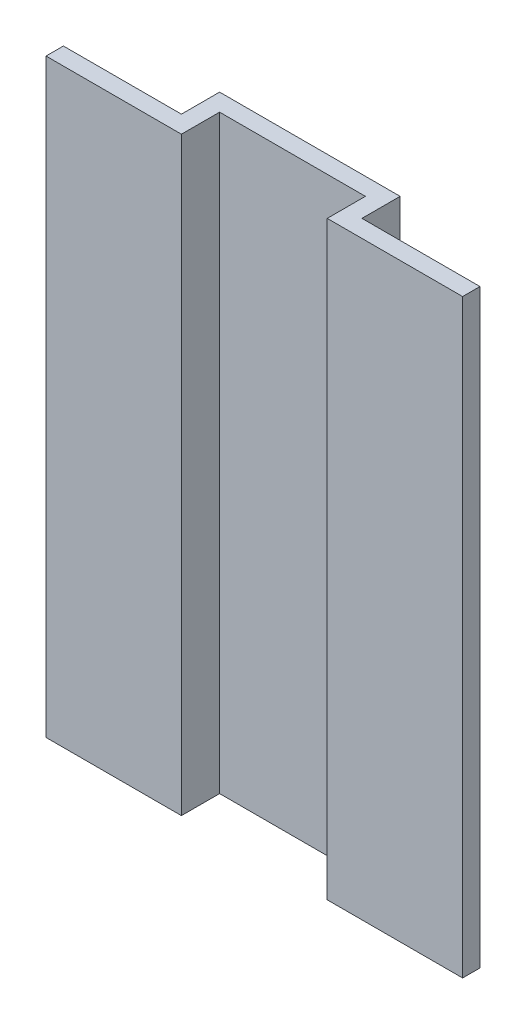
ISO-10303-21;
HEADER;
FILE_DESCRIPTION(('STEP AP214'),'2;1');
FILE_NAME('part.step','',(''),(''),'','','');
FILE_SCHEMA(('AUTOMOTIVE_DESIGN { 1 0 10303 214 1 1 1 1 }'));
ENDSEC;
DATA;
#1=APPLICATION_CONTEXT('core data for automotive mechanical design processes');
#2=APPLICATION_PROTOCOL_DEFINITION('international standard','automotive_design',2000,#1);
#3=PRODUCT_CONTEXT('',#1,'mechanical');
#4=PRODUCT('Part','Part','',(#3));
#5=PRODUCT_RELATED_PRODUCT_CATEGORY('part','',(#4));
#6=PRODUCT_DEFINITION_FORMATION('','',#4);
#7=PRODUCT_DEFINITION_CONTEXT('part definition',#1,'design');
#8=PRODUCT_DEFINITION('design','',#6,#7);
#9=PRODUCT_DEFINITION_SHAPE('','',#8);
#10=(LENGTH_UNIT() NAMED_UNIT(*) SI_UNIT(.MILLI.,.METRE.));
#11=(NAMED_UNIT(*) PLANE_ANGLE_UNIT() SI_UNIT($,.RADIAN.));
#12=(NAMED_UNIT(*) SI_UNIT($,.STERADIAN.) SOLID_ANGLE_UNIT());
#13=UNCERTAINTY_MEASURE_WITH_UNIT(LENGTH_MEASURE(1.E-05),#10,'distance_accuracy_value','');
#14=(GEOMETRIC_REPRESENTATION_CONTEXT(3) GLOBAL_UNCERTAINTY_ASSIGNED_CONTEXT((#13)) GLOBAL_UNIT_ASSIGNED_CONTEXT((#10,
#11,#12)) REPRESENTATION_CONTEXT('',''));
#15=CARTESIAN_POINT('',(0.,0.,0.));
#16=DIRECTION('',(0.,0.,1.));
#17=DIRECTION('',(1.,0.,0.));
#18=AXIS2_PLACEMENT_3D('',#15,#16,#17);
#19=CARTESIAN_POINT('',(21.,85.,0.));
#20=DIRECTION('',(1.,0.,0.));
#21=DIRECTION('',(0.,0.,-1.));
#22=AXIS2_PLACEMENT_3D('',#19,#20,#21);
#23=PLANE('',#22);
#24=DIRECTION('',(0.,0.,1.));
#25=VECTOR('',#24,1.);
#26=CARTESIAN_POINT('',(21.,-85.,0.));
#27=LINE('',#26,#25);
#28=CARTESIAN_POINT('',(21.,-85.,-6.));
#29=VERTEX_POINT('',#28);
#30=CARTESIAN_POINT('',(21.,-85.,5.));
#31=VERTEX_POINT('',#30);
#32=EDGE_CURVE('E167',#29,#31,#27,.T.);
#33=ORIENTED_EDGE('',*,*,#32,.T.);
#34=DIRECTION('',(0.,-1.,0.));
#35=VECTOR('',#34,1.);
#36=CARTESIAN_POINT('',(21.,85.,5.));
#37=LINE('',#36,#35);
#38=CARTESIAN_POINT('',(21.,85.,5.));
#39=VERTEX_POINT('',#38);
#40=EDGE_CURVE('E11',#39,#31,#37,.T.);
#41=ORIENTED_EDGE('',*,*,#40,.F.);
#42=DIRECTION('',(0.,0.,1.));
#43=VECTOR('',#42,1.);
#44=CARTESIAN_POINT('',(21.,85.,0.));
#45=LINE('',#44,#43);
#46=CARTESIAN_POINT('',(21.,85.,-6.));
#47=VERTEX_POINT('',#46);
#48=EDGE_CURVE('E194',#47,#39,#45,.T.);
#49=ORIENTED_EDGE('',*,*,#48,.F.);
#50=DIRECTION('',(0.,-1.,0.));
#51=VECTOR('',#50,1.);
#52=CARTESIAN_POINT('',(21.,85.,-6.));
#53=LINE('',#52,#51);
#54=EDGE_CURVE('E165',#47,#29,#53,.T.);
#55=ORIENTED_EDGE('',*,*,#54,.T.);
#56=EDGE_LOOP('',(#33,#41,#49,#55));
#57=FACE_BOUND('',#56,.T.);
#58=ADVANCED_FACE('F44',(#57),#23,.F.);
#59=CARTESIAN_POINT('',(0.,85.,5.));
#60=DIRECTION('',(0.,0.,-1.));
#61=DIRECTION('',(-1.,0.,0.));
#62=AXIS2_PLACEMENT_3D('',#59,#60,#61);
#63=PLANE('',#62);
#64=DIRECTION('',(1.,0.,0.));
#65=VECTOR('',#64,1.);
#66=CARTESIAN_POINT('',(0.,-85.,5.));
#67=LINE('',#66,#65);
#68=CARTESIAN_POINT('',(60.,-85.,5.));
#69=VERTEX_POINT('',#68);
#70=EDGE_CURVE('E166',#31,#69,#67,.T.);
#71=ORIENTED_EDGE('',*,*,#70,.T.);
#72=DIRECTION('',(0.,-1.,0.));
#73=VECTOR('',#72,1.);
#74=CARTESIAN_POINT('',(60.,85.,5.));
#75=LINE('',#74,#73);
#76=CARTESIAN_POINT('',(60.,85.,5.));
#77=VERTEX_POINT('',#76);
#78=EDGE_CURVE('E52',#77,#69,#75,.T.);
#79=ORIENTED_EDGE('',*,*,#78,.F.);
#80=DIRECTION('',(1.,0.,0.));
#81=VECTOR('',#80,1.);
#82=CARTESIAN_POINT('',(0.,85.,5.));
#83=LINE('',#82,#81);
#84=EDGE_CURVE('E118',#39,#77,#83,.T.);
#85=ORIENTED_EDGE('',*,*,#84,.F.);
#86=ORIENTED_EDGE('',*,*,#40,.T.);
#87=EDGE_LOOP('',(#71,#79,#85,#86));
#88=FACE_BOUND('',#87,.T.);
#89=ADVANCED_FACE('F216',(#88),#63,.F.);
#90=CARTESIAN_POINT('',(60.,85.,0.));
#91=DIRECTION('',(1.,0.,0.));
#92=DIRECTION('',(0.,0.,-1.));
#93=AXIS2_PLACEMENT_3D('',#90,#91,#92);
#94=PLANE('',#93);
#95=DIRECTION('',(0.,0.,1.));
#96=VECTOR('',#95,1.);
#97=CARTESIAN_POINT('',(60.,-85.,0.));
#98=LINE('',#97,#96);
#99=CARTESIAN_POINT('',(60.,-85.,0.));
#100=VERTEX_POINT('',#99);
#101=EDGE_CURVE('E175',#100,#69,#98,.T.);
#102=ORIENTED_EDGE('',*,*,#101,.F.);
#103=DIRECTION('',(0.,-1.,0.));
#104=VECTOR('',#103,1.);
#105=CARTESIAN_POINT('',(60.,85.,0.));
#106=LINE('',#105,#104);
#107=CARTESIAN_POINT('',(60.,85.,0.));
#108=VERTEX_POINT('',#107);
#109=EDGE_CURVE('E207',#108,#100,#106,.T.);
#110=ORIENTED_EDGE('',*,*,#109,.F.);
#111=DIRECTION('',(0.,0.,1.));
#112=VECTOR('',#111,1.);
#113=CARTESIAN_POINT('',(60.,85.,0.));
#114=LINE('',#113,#112);
#115=EDGE_CURVE('E214',#108,#77,#114,.T.);
#116=ORIENTED_EDGE('',*,*,#115,.T.);
#117=ORIENTED_EDGE('',*,*,#78,.T.);
#118=EDGE_LOOP('',(#102,#110,#116,#117));
#119=FACE_BOUND('',#118,.T.);
#120=ADVANCED_FACE('F213',(#119),#94,.T.);
#121=CARTESIAN_POINT('',(0.,85.,0.));
#122=DIRECTION('',(0.,0.,-1.));
#123=DIRECTION('',(-1.,0.,0.));
#124=AXIS2_PLACEMENT_3D('',#121,#122,#123);
#125=PLANE('',#124);
#126=DIRECTION('',(1.,0.,0.));
#127=VECTOR('',#126,1.);
#128=CARTESIAN_POINT('',(0.,-85.,0.));
#129=LINE('',#128,#127);
#130=CARTESIAN_POINT('',(26.,-85.,0.));
#131=VERTEX_POINT('',#130);
#132=EDGE_CURVE('E174',#131,#100,#129,.T.);
#133=ORIENTED_EDGE('',*,*,#132,.F.);
#134=DIRECTION('',(0.,-1.,0.));
#135=VECTOR('',#134,1.);
#136=CARTESIAN_POINT('',(26.,85.,0.));
#137=LINE('',#136,#135);
#138=CARTESIAN_POINT('',(26.,85.,0.));
#139=VERTEX_POINT('',#138);
#140=EDGE_CURVE('E210',#139,#131,#137,.T.);
#141=ORIENTED_EDGE('',*,*,#140,.F.);
#142=DIRECTION('',(1.,0.,0.));
#143=VECTOR('',#142,1.);
#144=CARTESIAN_POINT('',(0.,85.,0.));
#145=LINE('',#144,#143);
#146=EDGE_CURVE('E230',#139,#108,#145,.T.);
#147=ORIENTED_EDGE('',*,*,#146,.T.);
#148=ORIENTED_EDGE('',*,*,#109,.T.);
#149=EDGE_LOOP('',(#133,#141,#147,#148));
#150=FACE_BOUND('',#149,.T.);
#151=ADVANCED_FACE('F221',(#150),#125,.T.);
#152=CARTESIAN_POINT('',(26.,85.,0.));
#153=DIRECTION('',(1.,0.,0.));
#154=DIRECTION('',(0.,0.,-1.));
#155=AXIS2_PLACEMENT_3D('',#152,#153,#154);
#156=PLANE('',#155);
#157=DIRECTION('',(0.,0.,1.));
#158=VECTOR('',#157,1.);
#159=CARTESIAN_POINT('',(26.,-85.,0.));
#160=LINE('',#159,#158);
#161=CARTESIAN_POINT('',(26.,-85.,-11.));
#162=VERTEX_POINT('',#161);
#163=EDGE_CURVE('E176',#162,#131,#160,.T.);
#164=ORIENTED_EDGE('',*,*,#163,.F.);
#165=DIRECTION('',(0.,-1.,0.));
#166=VECTOR('',#165,1.);
#167=CARTESIAN_POINT('',(26.,85.,-11.));
#168=LINE('',#167,#166);
#169=CARTESIAN_POINT('',(26.,85.,-11.));
#170=VERTEX_POINT('',#169);
#171=EDGE_CURVE('E202',#170,#162,#168,.T.);
#172=ORIENTED_EDGE('',*,*,#171,.F.);
#173=DIRECTION('',(0.,0.,1.));
#174=VECTOR('',#173,1.);
#175=CARTESIAN_POINT('',(26.,85.,0.));
#176=LINE('',#175,#174);
#177=EDGE_CURVE('E233',#170,#139,#176,.T.);
#178=ORIENTED_EDGE('',*,*,#177,.T.);
#179=ORIENTED_EDGE('',*,*,#140,.T.);
#180=EDGE_LOOP('',(#164,#172,#178,#179));
#181=FACE_BOUND('',#180,.T.);
#182=ADVANCED_FACE('F331',(#181),#156,.T.);
#183=CARTESIAN_POINT('',(0.,85.,-11.));
#184=DIRECTION('',(0.,0.,-1.));
#185=DIRECTION('',(-1.,0.,0.));
#186=AXIS2_PLACEMENT_3D('',#183,#184,#185);
#187=PLANE('',#186);
#188=DIRECTION('',(1.,0.,0.));
#189=VECTOR('',#188,1.);
#190=CARTESIAN_POINT('',(0.,-85.,-11.));
#191=LINE('',#190,#189);
#192=CARTESIAN_POINT('',(-26.,-85.,-11.));
#193=VERTEX_POINT('',#192);
#194=EDGE_CURVE('E182',#193,#162,#191,.T.);
#195=ORIENTED_EDGE('',*,*,#194,.F.);
#196=DIRECTION('',(0.,-1.,0.));
#197=VECTOR('',#196,1.);
#198=CARTESIAN_POINT('',(-26.,85.,-11.));
#199=LINE('',#198,#197);
#200=CARTESIAN_POINT('',(-26.,85.,-11.));
#201=VERTEX_POINT('',#200);
#202=EDGE_CURVE('E201',#201,#193,#199,.T.);
#203=ORIENTED_EDGE('',*,*,#202,.F.);
#204=DIRECTION('',(1.,0.,0.));
#205=VECTOR('',#204,1.);
#206=CARTESIAN_POINT('',(0.,85.,-11.));
#207=LINE('',#206,#205);
#208=EDGE_CURVE('E240',#201,#170,#207,.T.);
#209=ORIENTED_EDGE('',*,*,#208,.T.);
#210=ORIENTED_EDGE('',*,*,#171,.T.);
#211=EDGE_LOOP('',(#195,#203,#209,#210));
#212=FACE_BOUND('',#211,.T.);
#213=ADVANCED_FACE('F324',(#212),#187,.T.);
#214=CARTESIAN_POINT('',(-26.,85.,0.));
#215=DIRECTION('',(-1.,0.,0.));
#216=DIRECTION('',(0.,0.,1.));
#217=AXIS2_PLACEMENT_3D('',#214,#215,#216);
#218=PLANE('',#217);
#219=DIRECTION('',(0.,0.,-1.));
#220=VECTOR('',#219,1.);
#221=CARTESIAN_POINT('',(-26.,-85.,0.));
#222=LINE('',#221,#220);
#223=CARTESIAN_POINT('',(-26.,-85.,0.));
#224=VERTEX_POINT('',#223);
#225=EDGE_CURVE('E184',#224,#193,#222,.T.);
#226=ORIENTED_EDGE('',*,*,#225,.F.);
#227=DIRECTION('',(0.,-1.,0.));
#228=VECTOR('',#227,1.);
#229=CARTESIAN_POINT('',(-26.,85.,0.));
#230=LINE('',#229,#228);
#231=CARTESIAN_POINT('',(-26.,85.,0.));
#232=VERTEX_POINT('',#231);
#233=EDGE_CURVE('E203',#232,#224,#230,.T.);
#234=ORIENTED_EDGE('',*,*,#233,.F.);
#235=DIRECTION('',(0.,0.,-1.));
#236=VECTOR('',#235,1.);
#237=CARTESIAN_POINT('',(-26.,85.,0.));
#238=LINE('',#237,#236);
#239=EDGE_CURVE('E238',#232,#201,#238,.T.);
#240=ORIENTED_EDGE('',*,*,#239,.T.);
#241=ORIENTED_EDGE('',*,*,#202,.T.);
#242=EDGE_LOOP('',(#226,#234,#240,#241));
#243=FACE_BOUND('',#242,.T.);
#244=ADVANCED_FACE('F252',(#243),#218,.T.);
#245=CARTESIAN_POINT('',(0.,85.,0.));
#246=DIRECTION('',(0.,0.,-1.));
#247=DIRECTION('',(-1.,0.,0.));
#248=AXIS2_PLACEMENT_3D('',#245,#246,#247);
#249=PLANE('',#248);
#250=DIRECTION('',(1.,0.,0.));
#251=VECTOR('',#250,1.);
#252=CARTESIAN_POINT('',(0.,-85.,0.));
#253=LINE('',#252,#251);
#254=CARTESIAN_POINT('',(-60.,-85.,0.));
#255=VERTEX_POINT('',#254);
#256=EDGE_CURVE('E190',#255,#224,#253,.T.);
#257=ORIENTED_EDGE('',*,*,#256,.F.);
#258=DIRECTION('',(0.,-1.,0.));
#259=VECTOR('',#258,1.);
#260=CARTESIAN_POINT('',(-60.,85.,0.));
#261=LINE('',#260,#259);
#262=CARTESIAN_POINT('',(-60.,85.,0.));
#263=VERTEX_POINT('',#262);
#264=EDGE_CURVE('E200',#263,#255,#261,.T.);
#265=ORIENTED_EDGE('',*,*,#264,.F.);
#266=DIRECTION('',(1.,0.,0.));
#267=VECTOR('',#266,1.);
#268=CARTESIAN_POINT('',(0.,85.,0.));
#269=LINE('',#268,#267);
#270=EDGE_CURVE('E241',#263,#232,#269,.T.);
#271=ORIENTED_EDGE('',*,*,#270,.T.);
#272=ORIENTED_EDGE('',*,*,#233,.T.);
#273=EDGE_LOOP('',(#257,#265,#271,#272));
#274=FACE_BOUND('',#273,.T.);
#275=ADVANCED_FACE('F250',(#274),#249,.T.);
#276=CARTESIAN_POINT('',(-60.,85.,0.));
#277=DIRECTION('',(1.,0.,0.));
#278=DIRECTION('',(0.,0.,-1.));
#279=AXIS2_PLACEMENT_3D('',#276,#277,#278);
#280=PLANE('',#279);
#281=DIRECTION('',(0.,0.,1.));
#282=VECTOR('',#281,1.);
#283=CARTESIAN_POINT('',(-60.,-85.,0.));
#284=LINE('',#283,#282);
#285=CARTESIAN_POINT('',(-60.,-85.,5.));
#286=VERTEX_POINT('',#285);
#287=EDGE_CURVE('E189',#255,#286,#284,.T.);
#288=ORIENTED_EDGE('',*,*,#287,.T.);
#289=DIRECTION('',(0.,-1.,0.));
#290=VECTOR('',#289,1.);
#291=CARTESIAN_POINT('',(-60.,85.,5.));
#292=LINE('',#291,#290);
#293=CARTESIAN_POINT('',(-60.,85.,5.));
#294=VERTEX_POINT('',#293);
#295=EDGE_CURVE('E160',#294,#286,#292,.T.);
#296=ORIENTED_EDGE('',*,*,#295,.F.);
#297=DIRECTION('',(0.,0.,1.));
#298=VECTOR('',#297,1.);
#299=CARTESIAN_POINT('',(-60.,85.,0.));
#300=LINE('',#299,#298);
#301=EDGE_CURVE('E146',#263,#294,#300,.T.);
#302=ORIENTED_EDGE('',*,*,#301,.F.);
#303=ORIENTED_EDGE('',*,*,#264,.T.);
#304=EDGE_LOOP('',(#288,#296,#302,#303));
#305=FACE_BOUND('',#304,.T.);
#306=ADVANCED_FACE('F258',(#305),#280,.F.);
#307=CARTESIAN_POINT('',(0.,85.,5.));
#308=DIRECTION('',(0.,0.,-1.));
#309=DIRECTION('',(-1.,0.,0.));
#310=AXIS2_PLACEMENT_3D('',#307,#308,#309);
#311=PLANE('',#310);
#312=DIRECTION('',(1.,0.,0.));
#313=VECTOR('',#312,1.);
#314=CARTESIAN_POINT('',(0.,-85.,5.));
#315=LINE('',#314,#313);
#316=CARTESIAN_POINT('',(-21.,-85.,5.));
#317=VERTEX_POINT('',#316);
#318=EDGE_CURVE('E156',#286,#317,#315,.T.);
#319=ORIENTED_EDGE('',*,*,#318,.T.);
#320=DIRECTION('',(0.,-1.,0.));
#321=VECTOR('',#320,1.);
#322=CARTESIAN_POINT('',(-21.,85.,5.));
#323=LINE('',#322,#321);
#324=CARTESIAN_POINT('',(-21.,85.,5.));
#325=VERTEX_POINT('',#324);
#326=EDGE_CURVE('E153',#325,#317,#323,.T.);
#327=ORIENTED_EDGE('',*,*,#326,.F.);
#328=DIRECTION('',(1.,0.,0.));
#329=VECTOR('',#328,1.);
#330=CARTESIAN_POINT('',(0.,85.,5.));
#331=LINE('',#330,#329);
#332=EDGE_CURVE('E143',#294,#325,#331,.T.);
#333=ORIENTED_EDGE('',*,*,#332,.F.);
#334=ORIENTED_EDGE('',*,*,#295,.T.);
#335=EDGE_LOOP('',(#319,#327,#333,#334));
#336=FACE_BOUND('',#335,.T.);
#337=ADVANCED_FACE('F152',(#336),#311,.F.);
#338=CARTESIAN_POINT('',(-21.,85.,0.));
#339=DIRECTION('',(-1.,0.,0.));
#340=DIRECTION('',(0.,0.,1.));
#341=AXIS2_PLACEMENT_3D('',#338,#339,#340);
#342=PLANE('',#341);
#343=DIRECTION('',(0.,0.,-1.));
#344=VECTOR('',#343,1.);
#345=CARTESIAN_POINT('',(-21.,-85.,0.));
#346=LINE('',#345,#344);
#347=CARTESIAN_POINT('',(-21.,-85.,-6.));
#348=VERTEX_POINT('',#347);
#349=EDGE_CURVE('E105',#317,#348,#346,.T.);
#350=ORIENTED_EDGE('',*,*,#349,.T.);
#351=DIRECTION('',(0.,-1.,0.));
#352=VECTOR('',#351,1.);
#353=CARTESIAN_POINT('',(-21.,85.,-6.));
#354=LINE('',#353,#352);
#355=CARTESIAN_POINT('',(-21.,85.,-6.));
#356=VERTEX_POINT('',#355);
#357=EDGE_CURVE('E158',#356,#348,#354,.T.);
#358=ORIENTED_EDGE('',*,*,#357,.F.);
#359=DIRECTION('',(0.,0.,-1.));
#360=VECTOR('',#359,1.);
#361=CARTESIAN_POINT('',(-21.,85.,0.));
#362=LINE('',#361,#360);
#363=EDGE_CURVE('E144',#325,#356,#362,.T.);
#364=ORIENTED_EDGE('',*,*,#363,.F.);
#365=ORIENTED_EDGE('',*,*,#326,.T.);
#366=EDGE_LOOP('',(#350,#358,#364,#365));
#367=FACE_BOUND('',#366,.T.);
#368=ADVANCED_FACE('F159',(#367),#342,.F.);
#369=CARTESIAN_POINT('',(0.,85.,-6.));
#370=DIRECTION('',(0.,0.,-1.));
#371=DIRECTION('',(-1.,0.,0.));
#372=AXIS2_PLACEMENT_3D('',#369,#370,#371);
#373=PLANE('',#372);
#374=DIRECTION('',(1.,0.,0.));
#375=VECTOR('',#374,1.);
#376=CARTESIAN_POINT('',(0.,-85.,-6.));
#377=LINE('',#376,#375);
#378=EDGE_CURVE('E107',#348,#29,#377,.T.);
#379=ORIENTED_EDGE('',*,*,#378,.T.);
#380=ORIENTED_EDGE('',*,*,#54,.F.);
#381=DIRECTION('',(1.,0.,0.));
#382=VECTOR('',#381,1.);
#383=CARTESIAN_POINT('',(0.,85.,-6.));
#384=LINE('',#383,#382);
#385=EDGE_CURVE('E63',#356,#47,#384,.T.);
#386=ORIENTED_EDGE('',*,*,#385,.F.);
#387=ORIENTED_EDGE('',*,*,#357,.T.);
#388=EDGE_LOOP('',(#379,#380,#386,#387));
#389=FACE_BOUND('',#388,.T.);
#390=ADVANCED_FACE('F271',(#389),#373,.F.);
#391=CARTESIAN_POINT('',(0.,85.,0.));
#392=DIRECTION('',(0.,1.,0.));
#393=DIRECTION('',(0.,0.,1.));
#394=AXIS2_PLACEMENT_3D('',#391,#392,#393);
#395=PLANE('',#394);
#396=ORIENTED_EDGE('',*,*,#48,.T.);
#397=ORIENTED_EDGE('',*,*,#84,.T.);
#398=ORIENTED_EDGE('',*,*,#115,.F.);
#399=ORIENTED_EDGE('',*,*,#146,.F.);
#400=ORIENTED_EDGE('',*,*,#177,.F.);
#401=ORIENTED_EDGE('',*,*,#208,.F.);
#402=ORIENTED_EDGE('',*,*,#239,.F.);
#403=ORIENTED_EDGE('',*,*,#270,.F.);
#404=ORIENTED_EDGE('',*,*,#301,.T.);
#405=ORIENTED_EDGE('',*,*,#332,.T.);
#406=ORIENTED_EDGE('',*,*,#363,.T.);
#407=ORIENTED_EDGE('',*,*,#385,.T.);
#408=EDGE_LOOP('',(#396,#397,#398,#399,#400,#401,#402,#403,#404,#405,#406,#407));
#409=FACE_BOUND('',#408,.T.);
#410=ADVANCED_FACE('F141',(#409),#395,.T.);
#411=CARTESIAN_POINT('',(0.,-85.,0.));
#412=DIRECTION('',(0.,1.,0.));
#413=DIRECTION('',(0.,0.,1.));
#414=AXIS2_PLACEMENT_3D('',#411,#412,#413);
#415=PLANE('',#414);
#416=ORIENTED_EDGE('',*,*,#32,.F.);
#417=ORIENTED_EDGE('',*,*,#378,.F.);
#418=ORIENTED_EDGE('',*,*,#349,.F.);
#419=ORIENTED_EDGE('',*,*,#318,.F.);
#420=ORIENTED_EDGE('',*,*,#287,.F.);
#421=ORIENTED_EDGE('',*,*,#256,.T.);
#422=ORIENTED_EDGE('',*,*,#225,.T.);
#423=ORIENTED_EDGE('',*,*,#194,.T.);
#424=ORIENTED_EDGE('',*,*,#163,.T.);
#425=ORIENTED_EDGE('',*,*,#132,.T.);
#426=ORIENTED_EDGE('',*,*,#101,.T.);
#427=ORIENTED_EDGE('',*,*,#70,.F.);
#428=EDGE_LOOP('',(#416,#417,#418,#419,#420,#421,#422,#423,#424,#425,#426,#427));
#429=FACE_BOUND('',#428,.T.);
#430=ADVANCED_FACE('F219',(#429),#415,.F.);
#431=CLOSED_SHELL('',(#58,#89,#120,#151,#182,#213,#244,#275,#306,#337,#368,#390,#410,#430));
#432=MANIFOLD_SOLID_BREP('B2',#431);
#433=ADVANCED_BREP_SHAPE_REPRESENTATION('',(#18,#432),#14);
#434=SHAPE_DEFINITION_REPRESENTATION(#9,#433);
ENDSEC;
END-ISO-10303-21;
